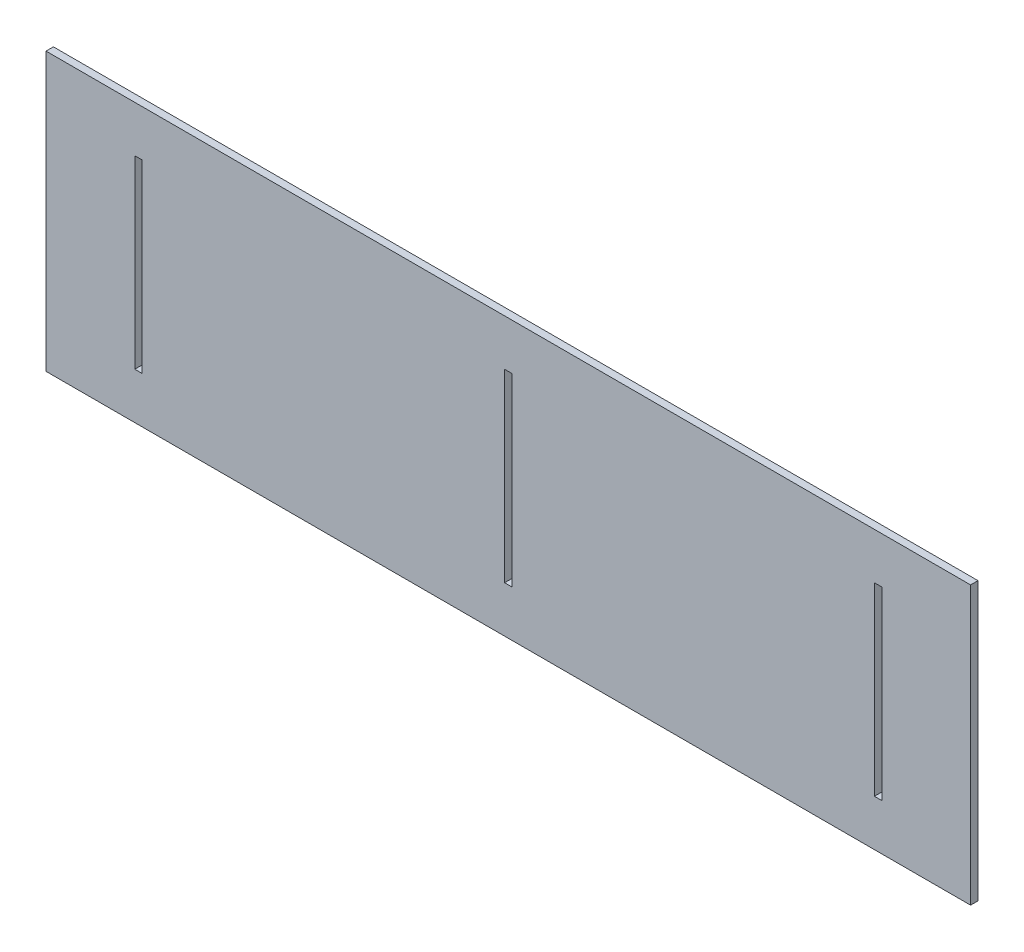
ISO-10303-21;
HEADER;
FILE_DESCRIPTION(('STEP AP214'),'2;1');
FILE_NAME('part.step','',(''),(''),'','','');
FILE_SCHEMA(('AUTOMOTIVE_DESIGN { 1 0 10303 214 1 1 1 1 }'));
ENDSEC;
DATA;
#1=APPLICATION_CONTEXT('core data for automotive mechanical design processes');
#2=APPLICATION_PROTOCOL_DEFINITION('international standard','automotive_design',2000,#1);
#3=PRODUCT_CONTEXT('',#1,'mechanical');
#4=PRODUCT('Part','Part','',(#3));
#5=PRODUCT_RELATED_PRODUCT_CATEGORY('part','',(#4));
#6=PRODUCT_DEFINITION_FORMATION('','',#4);
#7=PRODUCT_DEFINITION_CONTEXT('part definition',#1,'design');
#8=PRODUCT_DEFINITION('design','',#6,#7);
#9=PRODUCT_DEFINITION_SHAPE('','',#8);
#10=(LENGTH_UNIT() NAMED_UNIT(*) SI_UNIT(.MILLI.,.METRE.));
#11=(NAMED_UNIT(*) PLANE_ANGLE_UNIT() SI_UNIT($,.RADIAN.));
#12=(NAMED_UNIT(*) SI_UNIT($,.STERADIAN.) SOLID_ANGLE_UNIT());
#13=UNCERTAINTY_MEASURE_WITH_UNIT(LENGTH_MEASURE(1.E-05),#10,'distance_accuracy_value','');
#14=(GEOMETRIC_REPRESENTATION_CONTEXT(3) GLOBAL_UNCERTAINTY_ASSIGNED_CONTEXT((#13)) GLOBAL_UNIT_ASSIGNED_CONTEXT((#10,
#11,#12)) REPRESENTATION_CONTEXT('',''));
#15=CARTESIAN_POINT('',(0.,0.,0.));
#16=DIRECTION('',(0.,0.,1.));
#17=DIRECTION('',(1.,0.,0.));
#18=AXIS2_PLACEMENT_3D('',#15,#16,#17);
#19=CARTESIAN_POINT('',(0.,0.,2.));
#20=DIRECTION('',(0.,0.,1.));
#21=DIRECTION('',(1.,0.,0.));
#22=AXIS2_PLACEMENT_3D('',#19,#20,#21);
#23=PLANE('',#22);
#24=DIRECTION('',(0.,-1.,0.));
#25=VECTOR('',#24,1.);
#26=CARTESIAN_POINT('',(-73.681758713842,78.3846710241476,2.));
#27=LINE('',#26,#25);
#28=CARTESIAN_POINT('',(-73.681758713842,78.3846710241476,2.));
#29=VERTEX_POINT('',#28);
#30=CARTESIAN_POINT('',(-73.681758713842,3.3846710241476,2.));
#31=VERTEX_POINT('',#30);
#32=EDGE_CURVE('E244',#29,#31,#27,.T.);
#33=ORIENTED_EDGE('',*,*,#32,.T.);
#34=DIRECTION('',(1.,0.,0.));
#35=VECTOR('',#34,1.);
#36=CARTESIAN_POINT('',(-73.681758713842,3.3846710241476,2.));
#37=LINE('',#36,#35);
#38=CARTESIAN_POINT('',(176.318241286158,3.3846710241476,2.));
#39=VERTEX_POINT('',#38);
#40=EDGE_CURVE('E248',#31,#39,#37,.T.);
#41=ORIENTED_EDGE('',*,*,#40,.T.);
#42=DIRECTION('',(0.,1.,0.));
#43=VECTOR('',#42,1.);
#44=CARTESIAN_POINT('',(176.318241286158,78.3846710241476,2.));
#45=LINE('',#44,#43);
#46=CARTESIAN_POINT('',(176.318241286158,78.3846710241476,2.));
#47=VERTEX_POINT('',#46);
#48=EDGE_CURVE('E252',#39,#47,#45,.T.);
#49=ORIENTED_EDGE('',*,*,#48,.T.);
#50=DIRECTION('',(-1.,0.,0.));
#51=VECTOR('',#50,1.);
#52=CARTESIAN_POINT('',(-73.681758713842,78.3846710241476,2.));
#53=LINE('',#52,#51);
#54=EDGE_CURVE('E255',#47,#29,#53,.T.);
#55=ORIENTED_EDGE('',*,*,#54,.T.);
#56=EDGE_LOOP('',(#33,#41,#49,#55));
#57=FACE_BOUND('',#56,.T.);
#58=DIRECTION('',(0.,-1.,0.));
#59=VECTOR('',#58,1.);
#60=CARTESIAN_POINT('',(150.318241286158,65.8846710241477,2.));
#61=LINE('',#60,#59);
#62=CARTESIAN_POINT('',(150.318241286158,65.8846710241477,2.));
#63=VERTEX_POINT('',#62);
#64=CARTESIAN_POINT('',(150.318241286158,15.8846710241476,2.));
#65=VERTEX_POINT('',#64);
#66=EDGE_CURVE('E220',#63,#65,#61,.T.);
#67=ORIENTED_EDGE('',*,*,#66,.F.);
#68=DIRECTION('',(-1.,0.,0.));
#69=VECTOR('',#68,1.);
#70=CARTESIAN_POINT('',(152.318241286158,65.8846710241477,2.));
#71=LINE('',#70,#69);
#72=CARTESIAN_POINT('',(152.318241286158,65.8846710241477,2.));
#73=VERTEX_POINT('',#72);
#74=EDGE_CURVE('E217',#73,#63,#71,.T.);
#75=ORIENTED_EDGE('',*,*,#74,.F.);
#76=DIRECTION('',(0.,1.,0.));
#77=VECTOR('',#76,1.);
#78=CARTESIAN_POINT('',(152.318241286158,65.8846710241477,2.));
#79=LINE('',#78,#77);
#80=CARTESIAN_POINT('',(152.318241286158,15.8846710241476,2.));
#81=VERTEX_POINT('',#80);
#82=EDGE_CURVE('E227',#81,#73,#79,.T.);
#83=ORIENTED_EDGE('',*,*,#82,.F.);
#84=DIRECTION('',(1.,0.,0.));
#85=VECTOR('',#84,1.);
#86=CARTESIAN_POINT('',(152.318241286158,15.8846710241476,2.));
#87=LINE('',#86,#85);
#88=EDGE_CURVE('E223',#65,#81,#87,.T.);
#89=ORIENTED_EDGE('',*,*,#88,.F.);
#90=EDGE_LOOP('',(#67,#75,#83,#89));
#91=FACE_BOUND('',#90,.T.);
#92=DIRECTION('',(1.,0.,0.));
#93=VECTOR('',#92,1.);
#94=CARTESIAN_POINT('',(50.318241286158,15.8846710241476,2.));
#95=LINE('',#94,#93);
#96=CARTESIAN_POINT('',(50.318241286158,15.8846710241476,2.));
#97=VERTEX_POINT('',#96);
#98=CARTESIAN_POINT('',(52.318241286158,15.8846710241476,2.));
#99=VERTEX_POINT('',#98);
#100=EDGE_CURVE('E195',#97,#99,#95,.T.);
#101=ORIENTED_EDGE('',*,*,#100,.F.);
#102=DIRECTION('',(0.,-1.,0.));
#103=VECTOR('',#102,1.);
#104=CARTESIAN_POINT('',(50.318241286158,65.8846710241476,2.));
#105=LINE('',#104,#103);
#106=CARTESIAN_POINT('',(50.318241286158,65.8846710241476,2.));
#107=VERTEX_POINT('',#106);
#108=EDGE_CURVE('E192',#107,#97,#105,.T.);
#109=ORIENTED_EDGE('',*,*,#108,.F.);
#110=DIRECTION('',(-1.,0.,0.));
#111=VECTOR('',#110,1.);
#112=CARTESIAN_POINT('',(50.318241286158,65.8846710241476,2.));
#113=LINE('',#112,#111);
#114=CARTESIAN_POINT('',(52.318241286158,65.8846710241476,2.));
#115=VERTEX_POINT('',#114);
#116=EDGE_CURVE('E202',#115,#107,#113,.T.);
#117=ORIENTED_EDGE('',*,*,#116,.F.);
#118=DIRECTION('',(0.,1.,0.));
#119=VECTOR('',#118,1.);
#120=CARTESIAN_POINT('',(52.318241286158,65.8846710241476,2.));
#121=LINE('',#120,#119);
#122=EDGE_CURVE('E199',#99,#115,#121,.T.);
#123=ORIENTED_EDGE('',*,*,#122,.F.);
#124=EDGE_LOOP('',(#101,#109,#117,#123));
#125=FACE_BOUND('',#124,.T.);
#126=DIRECTION('',(1.,0.,0.));
#127=VECTOR('',#126,1.);
#128=CARTESIAN_POINT('',(-49.681758713842,15.8846710241476,2.));
#129=LINE('',#128,#127);
#130=CARTESIAN_POINT('',(-49.681758713842,15.8846710241476,2.));
#131=VERTEX_POINT('',#130);
#132=CARTESIAN_POINT('',(-47.681758713842,15.8846710241476,2.));
#133=VERTEX_POINT('',#132);
#134=EDGE_CURVE('E164',#131,#133,#129,.T.);
#135=ORIENTED_EDGE('',*,*,#134,.F.);
#136=DIRECTION('',(0.,-1.,0.));
#137=VECTOR('',#136,1.);
#138=CARTESIAN_POINT('',(-49.681758713842,65.8846710241476,2.));
#139=LINE('',#138,#137);
#140=CARTESIAN_POINT('',(-49.681758713842,65.8846710241476,2.));
#141=VERTEX_POINT('',#140);
#142=EDGE_CURVE('E154',#141,#131,#139,.T.);
#143=ORIENTED_EDGE('',*,*,#142,.F.);
#144=DIRECTION('',(-1.,0.,0.));
#145=VECTOR('',#144,1.);
#146=CARTESIAN_POINT('',(-49.681758713842,65.8846710241476,2.));
#147=LINE('',#146,#145);
#148=CARTESIAN_POINT('',(-47.681758713842,65.8846710241476,2.));
#149=VERTEX_POINT('',#148);
#150=EDGE_CURVE('E181',#149,#141,#147,.T.);
#151=ORIENTED_EDGE('',*,*,#150,.F.);
#152=DIRECTION('',(0.,1.,0.));
#153=VECTOR('',#152,1.);
#154=CARTESIAN_POINT('',(-47.681758713842,65.8846710241476,2.));
#155=LINE('',#154,#153);
#156=EDGE_CURVE('E177',#133,#149,#155,.T.);
#157=ORIENTED_EDGE('',*,*,#156,.F.);
#158=EDGE_LOOP('',(#135,#143,#151,#157));
#159=FACE_BOUND('',#158,.T.);
#160=ADVANCED_FACE('F39',(#57,#91,#125,#159),#23,.T.);
#161=CARTESIAN_POINT('',(0.,0.,0.));
#162=DIRECTION('',(0.,0.,1.));
#163=DIRECTION('',(1.,0.,0.));
#164=AXIS2_PLACEMENT_3D('',#161,#162,#163);
#165=PLANE('',#164);
#166=DIRECTION('',(0.,1.,0.));
#167=VECTOR('',#166,1.);
#168=CARTESIAN_POINT('',(50.318241286158,0.,0.));
#169=LINE('',#168,#167);
#170=CARTESIAN_POINT('',(50.318241286158,15.8846710241476,0.));
#171=VERTEX_POINT('',#170);
#172=CARTESIAN_POINT('',(50.318241286158,65.8846710241476,0.));
#173=VERTEX_POINT('',#172);
#174=EDGE_CURVE('E307',#171,#173,#169,.T.);
#175=ORIENTED_EDGE('',*,*,#174,.F.);
#176=DIRECTION('',(-1.,0.,0.));
#177=VECTOR('',#176,1.);
#178=CARTESIAN_POINT('',(0.,15.8846710241476,0.));
#179=LINE('',#178,#177);
#180=CARTESIAN_POINT('',(52.318241286158,15.8846710241476,0.));
#181=VERTEX_POINT('',#180);
#182=EDGE_CURVE('E304',#181,#171,#179,.T.);
#183=ORIENTED_EDGE('',*,*,#182,.F.);
#184=DIRECTION('',(0.,-1.,0.));
#185=VECTOR('',#184,1.);
#186=CARTESIAN_POINT('',(52.318241286158,0.,0.));
#187=LINE('',#186,#185);
#188=CARTESIAN_POINT('',(52.318241286158,65.8846710241476,0.));
#189=VERTEX_POINT('',#188);
#190=EDGE_CURVE('E301',#189,#181,#187,.T.);
#191=ORIENTED_EDGE('',*,*,#190,.F.);
#192=DIRECTION('',(1.,0.,0.));
#193=VECTOR('',#192,1.);
#194=CARTESIAN_POINT('',(0.,65.8846710241476,0.));
#195=LINE('',#194,#193);
#196=EDGE_CURVE('E298',#173,#189,#195,.T.);
#197=ORIENTED_EDGE('',*,*,#196,.F.);
#198=EDGE_LOOP('',(#175,#183,#191,#197));
#199=FACE_BOUND('',#198,.T.);
#200=DIRECTION('',(0.,-1.,0.));
#201=VECTOR('',#200,1.);
#202=CARTESIAN_POINT('',(-73.681758713842,78.3846710241476,0.));
#203=LINE('',#202,#201);
#204=CARTESIAN_POINT('',(-73.681758713842,78.3846710241476,0.));
#205=VERTEX_POINT('',#204);
#206=CARTESIAN_POINT('',(-73.681758713842,3.3846710241476,0.));
#207=VERTEX_POINT('',#206);
#208=EDGE_CURVE('E173',#205,#207,#203,.T.);
#209=ORIENTED_EDGE('',*,*,#208,.F.);
#210=DIRECTION('',(-1.,0.,0.));
#211=VECTOR('',#210,1.);
#212=CARTESIAN_POINT('',(-73.681758713842,78.3846710241476,0.));
#213=LINE('',#212,#211);
#214=CARTESIAN_POINT('',(176.318241286158,78.3846710241476,0.));
#215=VERTEX_POINT('',#214);
#216=EDGE_CURVE('E249',#215,#205,#213,.T.);
#217=ORIENTED_EDGE('',*,*,#216,.F.);
#218=DIRECTION('',(0.,1.,0.));
#219=VECTOR('',#218,1.);
#220=CARTESIAN_POINT('',(176.318241286158,78.3846710241476,0.));
#221=LINE('',#220,#219);
#222=CARTESIAN_POINT('',(176.318241286158,3.3846710241476,0.));
#223=VERTEX_POINT('',#222);
#224=EDGE_CURVE('E265',#223,#215,#221,.T.);
#225=ORIENTED_EDGE('',*,*,#224,.F.);
#226=DIRECTION('',(1.,0.,0.));
#227=VECTOR('',#226,1.);
#228=CARTESIAN_POINT('',(-73.681758713842,3.3846710241476,0.));
#229=LINE('',#228,#227);
#230=EDGE_CURVE('E262',#207,#223,#229,.T.);
#231=ORIENTED_EDGE('',*,*,#230,.F.);
#232=EDGE_LOOP('',(#209,#217,#225,#231));
#233=FACE_BOUND('',#232,.T.);
#234=DIRECTION('',(1.,0.,0.));
#235=VECTOR('',#234,1.);
#236=CARTESIAN_POINT('',(4.57166742130405E-13,65.8846710241487,0.));
#237=LINE('',#236,#235);
#238=CARTESIAN_POINT('',(150.318241286158,65.8846710241477,0.));
#239=VERTEX_POINT('',#238);
#240=CARTESIAN_POINT('',(152.318241286158,65.8846710241477,0.));
#241=VERTEX_POINT('',#240);
#242=EDGE_CURVE('E294',#239,#241,#237,.T.);
#243=ORIENTED_EDGE('',*,*,#242,.F.);
#244=DIRECTION('',(0.,1.,0.));
#245=VECTOR('',#244,1.);
#246=CARTESIAN_POINT('',(150.318241286158,0.,0.));
#247=LINE('',#246,#245);
#248=CARTESIAN_POINT('',(150.318241286158,15.8846710241476,0.));
#249=VERTEX_POINT('',#248);
#250=EDGE_CURVE('E291',#249,#239,#247,.T.);
#251=ORIENTED_EDGE('',*,*,#250,.F.);
#252=DIRECTION('',(-1.,0.,0.));
#253=VECTOR('',#252,1.);
#254=CARTESIAN_POINT('',(0.,15.8846710241479,0.));
#255=LINE('',#254,#253);
#256=CARTESIAN_POINT('',(152.318241286158,15.8846710241476,0.));
#257=VERTEX_POINT('',#256);
#258=EDGE_CURVE('E288',#257,#249,#255,.T.);
#259=ORIENTED_EDGE('',*,*,#258,.F.);
#260=DIRECTION('',(0.,-1.,0.));
#261=VECTOR('',#260,1.);
#262=CARTESIAN_POINT('',(152.318241286158,1.69107218546303E-13,0.));
#263=LINE('',#262,#261);
#264=EDGE_CURVE('E285',#241,#257,#263,.T.);
#265=ORIENTED_EDGE('',*,*,#264,.F.);
#266=EDGE_LOOP('',(#243,#251,#259,#265));
#267=FACE_BOUND('',#266,.T.);
#268=DIRECTION('',(0.,1.,0.));
#269=VECTOR('',#268,1.);
#270=CARTESIAN_POINT('',(-49.681758713842,0.,0.));
#271=LINE('',#270,#269);
#272=CARTESIAN_POINT('',(-49.681758713842,15.8846710241476,0.));
#273=VERTEX_POINT('',#272);
#274=CARTESIAN_POINT('',(-49.681758713842,65.8846710241476,0.));
#275=VERTEX_POINT('',#274);
#276=EDGE_CURVE('E11',#273,#275,#271,.T.);
#277=ORIENTED_EDGE('',*,*,#276,.F.);
#278=DIRECTION('',(-1.,0.,0.));
#279=VECTOR('',#278,1.);
#280=CARTESIAN_POINT('',(0.,15.8846710241477,0.));
#281=LINE('',#280,#279);
#282=CARTESIAN_POINT('',(-47.681758713842,15.8846710241476,0.));
#283=VERTEX_POINT('',#282);
#284=EDGE_CURVE('E48',#283,#273,#281,.T.);
#285=ORIENTED_EDGE('',*,*,#284,.F.);
#286=DIRECTION('',(0.,-1.,0.));
#287=VECTOR('',#286,1.);
#288=CARTESIAN_POINT('',(-47.681758713842,0.,0.));
#289=LINE('',#288,#287);
#290=CARTESIAN_POINT('',(-47.681758713842,65.8846710241476,0.));
#291=VERTEX_POINT('',#290);
#292=EDGE_CURVE('E314',#291,#283,#289,.T.);
#293=ORIENTED_EDGE('',*,*,#292,.F.);
#294=DIRECTION('',(1.,0.,0.));
#295=VECTOR('',#294,1.);
#296=CARTESIAN_POINT('',(-4.57166742130395E-13,65.8846710241479,0.));
#297=LINE('',#296,#295);
#298=EDGE_CURVE('E311',#275,#291,#297,.T.);
#299=ORIENTED_EDGE('',*,*,#298,.F.);
#300=EDGE_LOOP('',(#277,#285,#293,#299));
#301=FACE_BOUND('',#300,.T.);
#302=ADVANCED_FACE('F322',(#199,#233,#267,#301),#165,.F.);
#303=CARTESIAN_POINT('',(-73.681758713842,78.3846710241476,2.));
#304=DIRECTION('',(1.,0.,0.));
#305=DIRECTION('',(0.,0.,-1.));
#306=AXIS2_PLACEMENT_3D('',#303,#304,#305);
#307=PLANE('',#306);
#308=ORIENTED_EDGE('',*,*,#208,.T.);
#309=DIRECTION('',(0.,0.,-1.));
#310=VECTOR('',#309,1.);
#311=CARTESIAN_POINT('',(-73.681758713842,3.3846710241476,2.));
#312=LINE('',#311,#310);
#313=EDGE_CURVE('E281',#31,#207,#312,.T.);
#314=ORIENTED_EDGE('',*,*,#313,.F.);
#315=ORIENTED_EDGE('',*,*,#32,.F.);
#316=DIRECTION('',(0.,0.,-1.));
#317=VECTOR('',#316,1.);
#318=CARTESIAN_POINT('',(-73.681758713842,78.3846710241476,2.));
#319=LINE('',#318,#317);
#320=EDGE_CURVE('E258',#29,#205,#319,.T.);
#321=ORIENTED_EDGE('',*,*,#320,.T.);
#322=EDGE_LOOP('',(#308,#314,#315,#321));
#323=FACE_BOUND('',#322,.T.);
#324=ADVANCED_FACE('F41',(#323),#307,.F.);
#325=CARTESIAN_POINT('',(-73.681758713842,3.3846710241476,2.));
#326=DIRECTION('',(0.,1.,0.));
#327=DIRECTION('',(0.,0.,1.));
#328=AXIS2_PLACEMENT_3D('',#325,#326,#327);
#329=PLANE('',#328);
#330=ORIENTED_EDGE('',*,*,#230,.T.);
#331=DIRECTION('',(0.,0.,-1.));
#332=VECTOR('',#331,1.);
#333=CARTESIAN_POINT('',(176.318241286158,3.3846710241476,2.));
#334=LINE('',#333,#332);
#335=EDGE_CURVE('E277',#39,#223,#334,.T.);
#336=ORIENTED_EDGE('',*,*,#335,.F.);
#337=ORIENTED_EDGE('',*,*,#40,.F.);
#338=ORIENTED_EDGE('',*,*,#313,.T.);
#339=EDGE_LOOP('',(#330,#336,#337,#338));
#340=FACE_BOUND('',#339,.T.);
#341=ADVANCED_FACE('F349',(#340),#329,.F.);
#342=CARTESIAN_POINT('',(176.318241286158,78.3846710241476,2.));
#343=DIRECTION('',(-1.,0.,0.));
#344=DIRECTION('',(0.,0.,1.));
#345=AXIS2_PLACEMENT_3D('',#342,#343,#344);
#346=PLANE('',#345);
#347=ORIENTED_EDGE('',*,*,#224,.T.);
#348=DIRECTION('',(0.,0.,-1.));
#349=VECTOR('',#348,1.);
#350=CARTESIAN_POINT('',(176.318241286158,78.3846710241476,2.));
#351=LINE('',#350,#349);
#352=EDGE_CURVE('E273',#47,#215,#351,.T.);
#353=ORIENTED_EDGE('',*,*,#352,.F.);
#354=ORIENTED_EDGE('',*,*,#48,.F.);
#355=ORIENTED_EDGE('',*,*,#335,.T.);
#356=EDGE_LOOP('',(#347,#353,#354,#355));
#357=FACE_BOUND('',#356,.T.);
#358=ADVANCED_FACE('F346',(#357),#346,.F.);
#359=CARTESIAN_POINT('',(-73.681758713842,78.3846710241476,2.));
#360=DIRECTION('',(0.,-1.,0.));
#361=DIRECTION('',(0.,0.,-1.));
#362=AXIS2_PLACEMENT_3D('',#359,#360,#361);
#363=PLANE('',#362);
#364=ORIENTED_EDGE('',*,*,#216,.T.);
#365=ORIENTED_EDGE('',*,*,#320,.F.);
#366=ORIENTED_EDGE('',*,*,#54,.F.);
#367=ORIENTED_EDGE('',*,*,#352,.T.);
#368=EDGE_LOOP('',(#364,#365,#366,#367));
#369=FACE_BOUND('',#368,.T.);
#370=ADVANCED_FACE('F343',(#369),#363,.F.);
#371=CARTESIAN_POINT('',(152.318241286158,65.8846710241477,2.));
#372=DIRECTION('',(0.,-1.,0.));
#373=DIRECTION('',(1.,0.,0.));
#374=AXIS2_PLACEMENT_3D('',#371,#372,#373);
#375=PLANE('',#374);
#376=ORIENTED_EDGE('',*,*,#242,.T.);
#377=DIRECTION('',(0.,0.,-1.));
#378=VECTOR('',#377,1.);
#379=CARTESIAN_POINT('',(152.318241286158,65.8846710241477,2.));
#380=LINE('',#379,#378);
#381=EDGE_CURVE('E230',#73,#241,#380,.T.);
#382=ORIENTED_EDGE('',*,*,#381,.F.);
#383=ORIENTED_EDGE('',*,*,#74,.T.);
#384=DIRECTION('',(0.,0.,-1.));
#385=VECTOR('',#384,1.);
#386=CARTESIAN_POINT('',(150.318241286158,65.8846710241477,2.));
#387=LINE('',#386,#385);
#388=EDGE_CURVE('E196',#63,#239,#387,.T.);
#389=ORIENTED_EDGE('',*,*,#388,.T.);
#390=EDGE_LOOP('',(#376,#382,#383,#389));
#391=FACE_BOUND('',#390,.T.);
#392=ADVANCED_FACE('F340',(#391),#375,.T.);
#393=CARTESIAN_POINT('',(150.318241286158,65.8846710241477,2.));
#394=DIRECTION('',(1.,0.,0.));
#395=DIRECTION('',(0.,1.,0.));
#396=AXIS2_PLACEMENT_3D('',#393,#394,#395);
#397=PLANE('',#396);
#398=ORIENTED_EDGE('',*,*,#250,.T.);
#399=ORIENTED_EDGE('',*,*,#388,.F.);
#400=ORIENTED_EDGE('',*,*,#66,.T.);
#401=DIRECTION('',(0.,0.,-1.));
#402=VECTOR('',#401,1.);
#403=CARTESIAN_POINT('',(150.318241286158,15.8846710241476,2.));
#404=LINE('',#403,#402);
#405=EDGE_CURVE('E237',#65,#249,#404,.T.);
#406=ORIENTED_EDGE('',*,*,#405,.T.);
#407=EDGE_LOOP('',(#398,#399,#400,#406));
#408=FACE_BOUND('',#407,.T.);
#409=ADVANCED_FACE('F379',(#408),#397,.T.);
#410=CARTESIAN_POINT('',(152.318241286158,15.8846710241476,2.));
#411=DIRECTION('',(0.,1.,0.));
#412=DIRECTION('',(-1.,0.,0.));
#413=AXIS2_PLACEMENT_3D('',#410,#411,#412);
#414=PLANE('',#413);
#415=ORIENTED_EDGE('',*,*,#258,.T.);
#416=ORIENTED_EDGE('',*,*,#405,.F.);
#417=ORIENTED_EDGE('',*,*,#88,.T.);
#418=DIRECTION('',(0.,0.,-1.));
#419=VECTOR('',#418,1.);
#420=CARTESIAN_POINT('',(152.318241286158,15.8846710241476,2.));
#421=LINE('',#420,#419);
#422=EDGE_CURVE('E233',#81,#257,#421,.T.);
#423=ORIENTED_EDGE('',*,*,#422,.T.);
#424=EDGE_LOOP('',(#415,#416,#417,#423));
#425=FACE_BOUND('',#424,.T.);
#426=ADVANCED_FACE('F385',(#425),#414,.T.);
#427=CARTESIAN_POINT('',(152.318241286158,65.8846710241477,2.));
#428=DIRECTION('',(-1.,0.,0.));
#429=DIRECTION('',(0.,-1.,0.));
#430=AXIS2_PLACEMENT_3D('',#427,#428,#429);
#431=PLANE('',#430);
#432=ORIENTED_EDGE('',*,*,#264,.T.);
#433=ORIENTED_EDGE('',*,*,#422,.F.);
#434=ORIENTED_EDGE('',*,*,#82,.T.);
#435=ORIENTED_EDGE('',*,*,#381,.T.);
#436=EDGE_LOOP('',(#432,#433,#434,#435));
#437=FACE_BOUND('',#436,.T.);
#438=ADVANCED_FACE('F387',(#437),#431,.T.);
#439=CARTESIAN_POINT('',(50.318241286158,65.8846710241476,2.));
#440=DIRECTION('',(1.,0.,0.));
#441=DIRECTION('',(0.,0.,-1.));
#442=AXIS2_PLACEMENT_3D('',#439,#440,#441);
#443=PLANE('',#442);
#444=ORIENTED_EDGE('',*,*,#174,.T.);
#445=DIRECTION('',(0.,0.,-1.));
#446=VECTOR('',#445,1.);
#447=CARTESIAN_POINT('',(50.318241286158,65.8846710241476,2.));
#448=LINE('',#447,#446);
#449=EDGE_CURVE('E205',#107,#173,#448,.T.);
#450=ORIENTED_EDGE('',*,*,#449,.F.);
#451=ORIENTED_EDGE('',*,*,#108,.T.);
#452=DIRECTION('',(0.,0.,-1.));
#453=VECTOR('',#452,1.);
#454=CARTESIAN_POINT('',(50.318241286158,15.8846710241476,2.));
#455=LINE('',#454,#453);
#456=EDGE_CURVE('E165',#97,#171,#455,.T.);
#457=ORIENTED_EDGE('',*,*,#456,.T.);
#458=EDGE_LOOP('',(#444,#450,#451,#457));
#459=FACE_BOUND('',#458,.T.);
#460=ADVANCED_FACE('F389',(#459),#443,.T.);
#461=CARTESIAN_POINT('',(50.318241286158,15.8846710241476,2.));
#462=DIRECTION('',(0.,1.,0.));
#463=DIRECTION('',(0.,0.,1.));
#464=AXIS2_PLACEMENT_3D('',#461,#462,#463);
#465=PLANE('',#464);
#466=ORIENTED_EDGE('',*,*,#182,.T.);
#467=ORIENTED_EDGE('',*,*,#456,.F.);
#468=ORIENTED_EDGE('',*,*,#100,.T.);
#469=DIRECTION('',(0.,0.,-1.));
#470=VECTOR('',#469,1.);
#471=CARTESIAN_POINT('',(52.318241286158,15.8846710241476,2.));
#472=LINE('',#471,#470);
#473=EDGE_CURVE('E210',#99,#181,#472,.T.);
#474=ORIENTED_EDGE('',*,*,#473,.T.);
#475=EDGE_LOOP('',(#466,#467,#468,#474));
#476=FACE_BOUND('',#475,.T.);
#477=ADVANCED_FACE('F395',(#476),#465,.T.);
#478=CARTESIAN_POINT('',(52.318241286158,65.8846710241476,2.));
#479=DIRECTION('',(-1.,0.,0.));
#480=DIRECTION('',(0.,0.,1.));
#481=AXIS2_PLACEMENT_3D('',#478,#479,#480);
#482=PLANE('',#481);
#483=ORIENTED_EDGE('',*,*,#190,.T.);
#484=ORIENTED_EDGE('',*,*,#473,.F.);
#485=ORIENTED_EDGE('',*,*,#122,.T.);
#486=DIRECTION('',(0.,0.,-1.));
#487=VECTOR('',#486,1.);
#488=CARTESIAN_POINT('',(52.318241286158,65.8846710241476,2.));
#489=LINE('',#488,#487);
#490=EDGE_CURVE('E63',#115,#189,#489,.T.);
#491=ORIENTED_EDGE('',*,*,#490,.T.);
#492=EDGE_LOOP('',(#483,#484,#485,#491));
#493=FACE_BOUND('',#492,.T.);
#494=ADVANCED_FACE('F464',(#493),#482,.T.);
#495=CARTESIAN_POINT('',(50.318241286158,65.8846710241476,2.));
#496=DIRECTION('',(0.,-1.,0.));
#497=DIRECTION('',(0.,0.,-1.));
#498=AXIS2_PLACEMENT_3D('',#495,#496,#497);
#499=PLANE('',#498);
#500=ORIENTED_EDGE('',*,*,#196,.T.);
#501=ORIENTED_EDGE('',*,*,#490,.F.);
#502=ORIENTED_EDGE('',*,*,#116,.T.);
#503=ORIENTED_EDGE('',*,*,#449,.T.);
#504=EDGE_LOOP('',(#500,#501,#502,#503));
#505=FACE_BOUND('',#504,.T.);
#506=ADVANCED_FACE('F472',(#505),#499,.T.);
#507=CARTESIAN_POINT('',(-49.681758713842,65.8846710241476,2.));
#508=DIRECTION('',(1.,0.,0.));
#509=DIRECTION('',(0.,0.,-1.));
#510=AXIS2_PLACEMENT_3D('',#507,#508,#509);
#511=PLANE('',#510);
#512=ORIENTED_EDGE('',*,*,#276,.T.);
#513=DIRECTION('',(0.,0.,-1.));
#514=VECTOR('',#513,1.);
#515=CARTESIAN_POINT('',(-49.681758713842,65.8846710241476,2.));
#516=LINE('',#515,#514);
#517=EDGE_CURVE('E159',#141,#275,#516,.T.);
#518=ORIENTED_EDGE('',*,*,#517,.F.);
#519=ORIENTED_EDGE('',*,*,#142,.T.);
#520=DIRECTION('',(0.,0.,-1.));
#521=VECTOR('',#520,1.);
#522=CARTESIAN_POINT('',(-49.681758713842,15.8846710241476,2.));
#523=LINE('',#522,#521);
#524=EDGE_CURVE('E157',#131,#273,#523,.T.);
#525=ORIENTED_EDGE('',*,*,#524,.T.);
#526=EDGE_LOOP('',(#512,#518,#519,#525));
#527=FACE_BOUND('',#526,.T.);
#528=ADVANCED_FACE('F156',(#527),#511,.T.);
#529=CARTESIAN_POINT('',(-49.681758713842,15.8846710241476,2.));
#530=DIRECTION('',(0.,1.,0.));
#531=DIRECTION('',(-1.,0.,0.));
#532=AXIS2_PLACEMENT_3D('',#529,#530,#531);
#533=PLANE('',#532);
#534=ORIENTED_EDGE('',*,*,#284,.T.);
#535=ORIENTED_EDGE('',*,*,#524,.F.);
#536=ORIENTED_EDGE('',*,*,#134,.T.);
#537=DIRECTION('',(0.,0.,-1.));
#538=VECTOR('',#537,1.);
#539=CARTESIAN_POINT('',(-47.681758713842,15.8846710241476,2.));
#540=LINE('',#539,#538);
#541=EDGE_CURVE('E174',#133,#283,#540,.T.);
#542=ORIENTED_EDGE('',*,*,#541,.T.);
#543=EDGE_LOOP('',(#534,#535,#536,#542));
#544=FACE_BOUND('',#543,.T.);
#545=ADVANCED_FACE('F168',(#544),#533,.T.);
#546=CARTESIAN_POINT('',(-47.681758713842,65.8846710241476,2.));
#547=DIRECTION('',(-1.,0.,0.));
#548=DIRECTION('',(0.,0.,1.));
#549=AXIS2_PLACEMENT_3D('',#546,#547,#548);
#550=PLANE('',#549);
#551=ORIENTED_EDGE('',*,*,#292,.T.);
#552=ORIENTED_EDGE('',*,*,#541,.F.);
#553=ORIENTED_EDGE('',*,*,#156,.T.);
#554=DIRECTION('',(0.,0.,-1.));
#555=VECTOR('',#554,1.);
#556=CARTESIAN_POINT('',(-47.681758713842,65.8846710241476,2.));
#557=LINE('',#556,#555);
#558=EDGE_CURVE('E55',#149,#291,#557,.T.);
#559=ORIENTED_EDGE('',*,*,#558,.T.);
#560=EDGE_LOOP('',(#551,#552,#553,#559));
#561=FACE_BOUND('',#560,.T.);
#562=ADVANCED_FACE('F319',(#561),#550,.T.);
#563=CARTESIAN_POINT('',(-49.681758713842,65.8846710241476,2.));
#564=DIRECTION('',(0.,-1.,0.));
#565=DIRECTION('',(1.,0.,0.));
#566=AXIS2_PLACEMENT_3D('',#563,#564,#565);
#567=PLANE('',#566);
#568=ORIENTED_EDGE('',*,*,#298,.T.);
#569=ORIENTED_EDGE('',*,*,#558,.F.);
#570=ORIENTED_EDGE('',*,*,#150,.T.);
#571=ORIENTED_EDGE('',*,*,#517,.T.);
#572=EDGE_LOOP('',(#568,#569,#570,#571));
#573=FACE_BOUND('',#572,.T.);
#574=ADVANCED_FACE('F323',(#573),#567,.T.);
#575=CLOSED_SHELL('',(#160,#302,#324,#341,#358,#370,#392,#409,#426,#438,#460,#477,#494,#506,
#528,#545,#562,#574));
#576=MANIFOLD_SOLID_BREP('B2',#575);
#577=ADVANCED_BREP_SHAPE_REPRESENTATION('',(#18,#576),#14);
#578=SHAPE_DEFINITION_REPRESENTATION(#9,#577);
ENDSEC;
END-ISO-10303-21;
